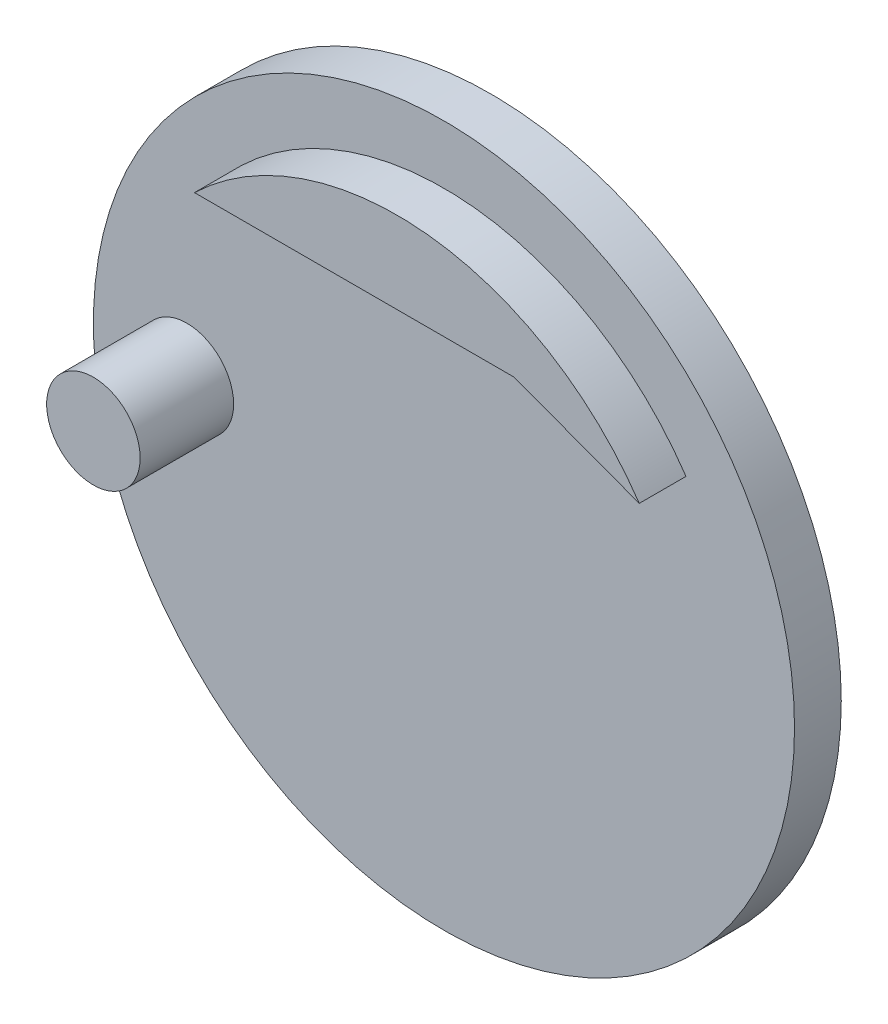
ISO-10303-21;
HEADER;
FILE_DESCRIPTION(('STEP AP214'),'2;1');
FILE_NAME('part.step','',(''),(''),'','','');
FILE_SCHEMA(('AUTOMOTIVE_DESIGN { 1 0 10303 214 1 1 1 1 }'));
ENDSEC;
DATA;
#1=APPLICATION_CONTEXT('core data for automotive mechanical design processes');
#2=APPLICATION_PROTOCOL_DEFINITION('international standard','automotive_design',2000,#1);
#3=PRODUCT_CONTEXT('',#1,'mechanical');
#4=PRODUCT('Part','Part','',(#3));
#5=PRODUCT_RELATED_PRODUCT_CATEGORY('part','',(#4));
#6=PRODUCT_DEFINITION_FORMATION('','',#4);
#7=PRODUCT_DEFINITION_CONTEXT('part definition',#1,'design');
#8=PRODUCT_DEFINITION('design','',#6,#7);
#9=PRODUCT_DEFINITION_SHAPE('','',#8);
#10=(LENGTH_UNIT() NAMED_UNIT(*) SI_UNIT(.MILLI.,.METRE.));
#11=(NAMED_UNIT(*) PLANE_ANGLE_UNIT() SI_UNIT($,.RADIAN.));
#12=(NAMED_UNIT(*) SI_UNIT($,.STERADIAN.) SOLID_ANGLE_UNIT());
#13=UNCERTAINTY_MEASURE_WITH_UNIT(LENGTH_MEASURE(1.E-05),#10,'distance_accuracy_value','');
#14=(GEOMETRIC_REPRESENTATION_CONTEXT(3) GLOBAL_UNCERTAINTY_ASSIGNED_CONTEXT((#13)) GLOBAL_UNIT_ASSIGNED_CONTEXT((#10,
#11,#12)) REPRESENTATION_CONTEXT('',''));
#15=CARTESIAN_POINT('',(0.,0.,0.));
#16=DIRECTION('',(0.,0.,1.));
#17=DIRECTION('',(1.,0.,0.));
#18=AXIS2_PLACEMENT_3D('',#15,#16,#17);
#19=CARTESIAN_POINT('',(0.,0.,5.));
#20=DIRECTION('',(0.,0.,1.));
#21=DIRECTION('',(1.,0.,0.));
#22=AXIS2_PLACEMENT_3D('',#19,#20,#21);
#23=PLANE('',#22);
#24=CARTESIAN_POINT('',(-27.5,0.,5.));
#25=DIRECTION('',(0.,0.,1.));
#26=DIRECTION('',(1.,0.,0.));
#27=AXIS2_PLACEMENT_3D('',#24,#25,#26);
#28=CIRCLE('',#27,5.);
#29=CARTESIAN_POINT('',(-22.5,0.,5.));
#30=VERTEX_POINT('',#29);
#31=EDGE_CURVE('E118',#30,#30,#28,.T.);
#32=ORIENTED_EDGE('',*,*,#31,.F.);
#33=EDGE_LOOP('',(#32));
#34=FACE_BOUND('',#33,.T.);
#35=CARTESIAN_POINT('',(0.,0.,5.));
#36=DIRECTION('',(0.,0.,1.));
#37=DIRECTION('',(1.,0.,0.));
#38=AXIS2_PLACEMENT_3D('',#35,#36,#37);
#39=CIRCLE('',#38,37.5);
#40=CARTESIAN_POINT('',(37.5,0.,5.));
#41=VERTEX_POINT('',#40);
#42=EDGE_CURVE('E11',#41,#41,#39,.T.);
#43=ORIENTED_EDGE('',*,*,#42,.T.);
#44=EDGE_LOOP('',(#43));
#45=FACE_BOUND('',#44,.T.);
#46=DIRECTION('',(1.,0.,0.));
#47=VECTOR('',#46,1.);
#48=CARTESIAN_POINT('',(12.5,22.5,5.));
#49=LINE('',#48,#47);
#50=CARTESIAN_POINT('',(-21.6866894661218,22.5,5.));
#51=VERTEX_POINT('',#50);
#52=CARTESIAN_POINT('',(12.5,22.5,5.));
#53=VERTEX_POINT('',#52);
#54=EDGE_CURVE('E110',#51,#53,#49,.T.);
#55=ORIENTED_EDGE('',*,*,#54,.F.);
#56=CARTESIAN_POINT('',(0.,0.,5.));
#57=DIRECTION('',(0.,0.,1.));
#58=DIRECTION('',(-1.,0.,0.));
#59=AXIS2_PLACEMENT_3D('',#56,#57,#58);
#60=CIRCLE('',#59,31.25);
#61=CARTESIAN_POINT('',(25.89039397151,17.5,5.));
#62=VERTEX_POINT('',#61);
#63=EDGE_CURVE('E96',#62,#51,#60,.T.);
#64=ORIENTED_EDGE('',*,*,#63,.F.);
#65=DIRECTION('',(0.936820432403996,-0.349810630813858,0.));
#66=VECTOR('',#65,1.);
#67=CARTESIAN_POINT('',(25.89039397151,17.5,5.));
#68=LINE('',#67,#66);
#69=EDGE_CURVE('E77',#53,#62,#68,.T.);
#70=ORIENTED_EDGE('',*,*,#69,.F.);
#71=EDGE_LOOP('',(#55,#64,#70));
#72=FACE_BOUND('',#71,.T.);
#73=ADVANCED_FACE('F43',(#34,#45,#72),#23,.T.);
#74=CARTESIAN_POINT('',(0.,0.,5.));
#75=DIRECTION('',(0.,0.,-1.));
#76=DIRECTION('',(-1.,0.,0.));
#77=AXIS2_PLACEMENT_3D('',#74,#75,#76);
#78=CYLINDRICAL_SURFACE('',#77,37.5);
#79=ORIENTED_EDGE('',*,*,#42,.F.);
#80=EDGE_LOOP('',(#79));
#81=FACE_BOUND('',#80,.T.);
#82=CARTESIAN_POINT('',(0.,0.,0.));
#83=DIRECTION('',(0.,0.,1.));
#84=DIRECTION('',(1.,0.,0.));
#85=AXIS2_PLACEMENT_3D('',#82,#83,#84);
#86=CIRCLE('',#85,37.5);
#87=CARTESIAN_POINT('',(37.5,0.,0.));
#88=VERTEX_POINT('',#87);
#89=EDGE_CURVE('E47',#88,#88,#86,.T.);
#90=ORIENTED_EDGE('',*,*,#89,.T.);
#91=EDGE_LOOP('',(#90));
#92=FACE_BOUND('',#91,.T.);
#93=ADVANCED_FACE('F45',(#81,#92),#78,.T.);
#94=CARTESIAN_POINT('',(0.,0.,0.));
#95=DIRECTION('',(0.,0.,1.));
#96=DIRECTION('',(1.,0.,0.));
#97=AXIS2_PLACEMENT_3D('',#94,#95,#96);
#98=PLANE('',#97);
#99=ORIENTED_EDGE('',*,*,#89,.F.);
#100=EDGE_LOOP('',(#99));
#101=FACE_BOUND('',#100,.T.);
#102=ADVANCED_FACE('F142',(#101),#98,.F.);
#103=CARTESIAN_POINT('',(0.,0.,10.));
#104=DIRECTION('',(0.,0.,-1.));
#105=DIRECTION('',(-1.,0.,0.));
#106=AXIS2_PLACEMENT_3D('',#103,#104,#105);
#107=CYLINDRICAL_SURFACE('',#106,31.25);
#108=ORIENTED_EDGE('',*,*,#63,.T.);
#109=DIRECTION('',(0.,0.,-1.));
#110=VECTOR('',#109,1.);
#111=CARTESIAN_POINT('',(-21.6866894661218,22.5,10.));
#112=LINE('',#111,#110);
#113=CARTESIAN_POINT('',(-21.6866894661218,22.5,10.));
#114=VERTEX_POINT('',#113);
#115=EDGE_CURVE('E84',#114,#51,#112,.T.);
#116=ORIENTED_EDGE('',*,*,#115,.F.);
#117=CARTESIAN_POINT('',(0.,0.,10.));
#118=DIRECTION('',(0.,0.,1.));
#119=DIRECTION('',(-1.,0.,0.));
#120=AXIS2_PLACEMENT_3D('',#117,#118,#119);
#121=CIRCLE('',#120,31.25);
#122=CARTESIAN_POINT('',(25.89039397151,17.5,10.));
#123=VERTEX_POINT('',#122);
#124=EDGE_CURVE('E87',#123,#114,#121,.T.);
#125=ORIENTED_EDGE('',*,*,#124,.F.);
#126=DIRECTION('',(0.,0.,-1.));
#127=VECTOR('',#126,1.);
#128=CARTESIAN_POINT('',(25.89039397151,17.5,10.));
#129=LINE('',#128,#127);
#130=EDGE_CURVE('E103',#123,#62,#129,.T.);
#131=ORIENTED_EDGE('',*,*,#130,.T.);
#132=EDGE_LOOP('',(#108,#116,#125,#131));
#133=FACE_BOUND('',#132,.T.);
#134=ADVANCED_FACE('F94',(#133),#107,.T.);
#135=CARTESIAN_POINT('',(12.5,22.5,10.));
#136=DIRECTION('',(0.,1.,0.));
#137=DIRECTION('',(0.,0.,1.));
#138=AXIS2_PLACEMENT_3D('',#135,#136,#137);
#139=PLANE('',#138);
#140=ORIENTED_EDGE('',*,*,#54,.T.);
#141=DIRECTION('',(0.,0.,-1.));
#142=VECTOR('',#141,1.);
#143=CARTESIAN_POINT('',(12.5,22.5,10.));
#144=LINE('',#143,#142);
#145=CARTESIAN_POINT('',(12.5,22.5,10.));
#146=VERTEX_POINT('',#145);
#147=EDGE_CURVE('E59',#146,#53,#144,.T.);
#148=ORIENTED_EDGE('',*,*,#147,.F.);
#149=DIRECTION('',(1.,0.,0.));
#150=VECTOR('',#149,1.);
#151=CARTESIAN_POINT('',(12.5,22.5,10.));
#152=LINE('',#151,#150);
#153=EDGE_CURVE('E81',#114,#146,#152,.T.);
#154=ORIENTED_EDGE('',*,*,#153,.F.);
#155=ORIENTED_EDGE('',*,*,#115,.T.);
#156=EDGE_LOOP('',(#140,#148,#154,#155));
#157=FACE_BOUND('',#156,.T.);
#158=ADVANCED_FACE('F82',(#157),#139,.F.);
#159=CARTESIAN_POINT('',(25.89039397151,17.5,10.));
#160=DIRECTION('',(0.349810630813858,0.936820432403996,0.));
#161=DIRECTION('',(-0.936820432403996,0.349810630813858,0.));
#162=AXIS2_PLACEMENT_3D('',#159,#160,#161);
#163=PLANE('',#162);
#164=ORIENTED_EDGE('',*,*,#69,.T.);
#165=ORIENTED_EDGE('',*,*,#130,.F.);
#166=DIRECTION('',(0.936820432403996,-0.349810630813858,0.));
#167=VECTOR('',#166,1.);
#168=CARTESIAN_POINT('',(25.89039397151,17.5,10.));
#169=LINE('',#168,#167);
#170=EDGE_CURVE('E67',#146,#123,#169,.T.);
#171=ORIENTED_EDGE('',*,*,#170,.F.);
#172=ORIENTED_EDGE('',*,*,#147,.T.);
#173=EDGE_LOOP('',(#164,#165,#171,#172));
#174=FACE_BOUND('',#173,.T.);
#175=ADVANCED_FACE('F153',(#174),#163,.F.);
#176=CARTESIAN_POINT('',(0.,0.,10.));
#177=DIRECTION('',(0.,0.,-1.));
#178=DIRECTION('',(-1.,0.,0.));
#179=AXIS2_PLACEMENT_3D('',#176,#177,#178);
#180=PLANE('',#179);
#181=ORIENTED_EDGE('',*,*,#124,.T.);
#182=ORIENTED_EDGE('',*,*,#153,.T.);
#183=ORIENTED_EDGE('',*,*,#170,.T.);
#184=EDGE_LOOP('',(#181,#182,#183));
#185=FACE_BOUND('',#184,.T.);
#186=ADVANCED_FACE('F90',(#185),#180,.F.);
#187=CARTESIAN_POINT('',(-27.5,0.,15.));
#188=DIRECTION('',(0.,0.,-1.));
#189=DIRECTION('',(-1.,0.,0.));
#190=AXIS2_PLACEMENT_3D('',#187,#188,#189);
#191=CYLINDRICAL_SURFACE('',#190,5.);
#192=CARTESIAN_POINT('',(-27.5,0.,15.));
#193=DIRECTION('',(0.,0.,1.));
#194=DIRECTION('',(1.,0.,0.));
#195=AXIS2_PLACEMENT_3D('',#192,#193,#194);
#196=CIRCLE('',#195,5.);
#197=CARTESIAN_POINT('',(-22.5,0.,15.));
#198=VERTEX_POINT('',#197);
#199=EDGE_CURVE('E115',#198,#198,#196,.T.);
#200=ORIENTED_EDGE('',*,*,#199,.F.);
#201=EDGE_LOOP('',(#200));
#202=FACE_BOUND('',#201,.T.);
#203=ORIENTED_EDGE('',*,*,#31,.T.);
#204=EDGE_LOOP('',(#203));
#205=FACE_BOUND('',#204,.T.);
#206=ADVANCED_FACE('F128',(#202,#205),#191,.T.);
#207=CARTESIAN_POINT('',(-27.5,0.,15.));
#208=DIRECTION('',(0.,0.,1.));
#209=DIRECTION('',(1.,0.,0.));
#210=AXIS2_PLACEMENT_3D('',#207,#208,#209);
#211=PLANE('',#210);
#212=ORIENTED_EDGE('',*,*,#199,.T.);
#213=EDGE_LOOP('',(#212));
#214=FACE_BOUND('',#213,.T.);
#215=ADVANCED_FACE('F126',(#214),#211,.T.);
#216=CLOSED_SHELL('',(#73,#93,#102,#134,#158,#175,#186,#206,#215));
#217=MANIFOLD_SOLID_BREP('B2',#216);
#218=ADVANCED_BREP_SHAPE_REPRESENTATION('',(#18,#217),#14);
#219=SHAPE_DEFINITION_REPRESENTATION(#9,#218);
ENDSEC;
END-ISO-10303-21;
